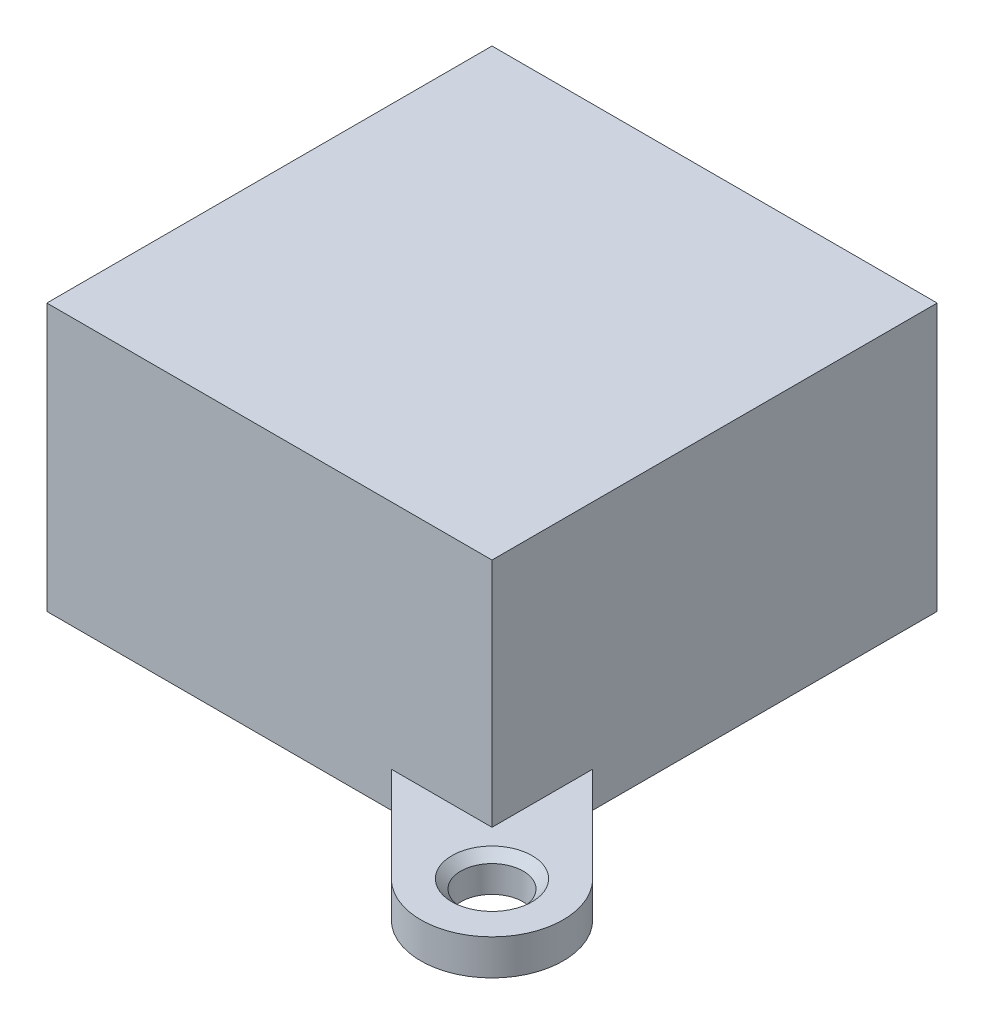
ISO-10303-21;
HEADER;
FILE_DESCRIPTION(('STEP AP214'),'2;1');
FILE_NAME('part.step','',(''),(''),'','','');
FILE_SCHEMA(('AUTOMOTIVE_DESIGN { 1 0 10303 214 1 1 1 1 }'));
ENDSEC;
DATA;
#1=APPLICATION_CONTEXT('core data for automotive mechanical design processes');
#2=APPLICATION_PROTOCOL_DEFINITION('international standard','automotive_design',2000,#1);
#3=PRODUCT_CONTEXT('',#1,'mechanical');
#4=PRODUCT('Part','Part','',(#3));
#5=PRODUCT_RELATED_PRODUCT_CATEGORY('part','',(#4));
#6=PRODUCT_DEFINITION_FORMATION('','',#4);
#7=PRODUCT_DEFINITION_CONTEXT('part definition',#1,'design');
#8=PRODUCT_DEFINITION('design','',#6,#7);
#9=PRODUCT_DEFINITION_SHAPE('','',#8);
#10=(LENGTH_UNIT() NAMED_UNIT(*) SI_UNIT(.MILLI.,.METRE.));
#11=(NAMED_UNIT(*) PLANE_ANGLE_UNIT() SI_UNIT($,.RADIAN.));
#12=(NAMED_UNIT(*) SI_UNIT($,.STERADIAN.) SOLID_ANGLE_UNIT());
#13=UNCERTAINTY_MEASURE_WITH_UNIT(LENGTH_MEASURE(1.E-05),#10,'distance_accuracy_value','');
#14=(GEOMETRIC_REPRESENTATION_CONTEXT(3) GLOBAL_UNCERTAINTY_ASSIGNED_CONTEXT((#13)) GLOBAL_UNIT_ASSIGNED_CONTEXT((#10,
#11,#12)) REPRESENTATION_CONTEXT('',''));
#15=CARTESIAN_POINT('',(0.,0.,0.));
#16=DIRECTION('',(0.,0.,1.));
#17=DIRECTION('',(1.,0.,0.));
#18=AXIS2_PLACEMENT_3D('',#15,#16,#17);
#19=CARTESIAN_POINT('',(15.,1.99999999989586,15.));
#20=DIRECTION('',(0.,1.,0.));
#21=DIRECTION('',(0.,0.,1.));
#22=AXIS2_PLACEMENT_3D('',#19,#20,#21);
#23=CONICAL_SURFACE('',#22,2.24999999987631,0.785398163397448);
#24=CARTESIAN_POINT('',(15.,1.5,15.));
#25=DIRECTION('',(0.,1.,0.));
#26=DIRECTION('',(0.,0.,1.));
#27=AXIS2_PLACEMENT_3D('',#24,#25,#26);
#28=CIRCLE('',#27,1.75);
#29=CARTESIAN_POINT('',(15.,1.5,16.75));
#30=VERTEX_POINT('',#29);
#31=EDGE_CURVE('E154',#30,#30,#28,.F.);
#32=ORIENTED_EDGE('',*,*,#31,.T.);
#33=EDGE_LOOP('',(#32));
#34=FACE_BOUND('',#33,.T.);
#35=CARTESIAN_POINT('',(15.,2.00000000002319,15.));
#36=DIRECTION('',(0.,1.,0.));
#37=DIRECTION('',(0.,0.,1.));
#38=AXIS2_PLACEMENT_3D('',#35,#36,#37);
#39=CIRCLE('',#38,2.25000000000364);
#40=CARTESIAN_POINT('',(15.,2.00000000002319,17.2500000000036));
#41=VERTEX_POINT('',#40);
#42=EDGE_CURVE('E19',#41,#41,#39,.T.);
#43=ORIENTED_EDGE('',*,*,#42,.T.);
#44=EDGE_LOOP('',(#43));
#45=FACE_BOUND('',#44,.T.);
#46=ADVANCED_FACE('F16',(#34,#45),#23,.F.);
#47=CARTESIAN_POINT('',(-15.,1.99999999995271,-15.));
#48=DIRECTION('',(0.,1.,0.));
#49=DIRECTION('',(0.,0.,1.));
#50=AXIS2_PLACEMENT_3D('',#47,#48,#49);
#51=CONICAL_SURFACE('',#50,2.24999999990359,0.785398163397448);
#52=CARTESIAN_POINT('',(-15.,1.5,-15.));
#53=DIRECTION('',(0.,1.,0.));
#54=DIRECTION('',(0.,0.,1.));
#55=AXIS2_PLACEMENT_3D('',#52,#53,#54);
#56=CIRCLE('',#55,1.75);
#57=CARTESIAN_POINT('',(-15.,1.5,-13.25));
#58=VERTEX_POINT('',#57);
#59=EDGE_CURVE('E151',#58,#58,#56,.F.);
#60=ORIENTED_EDGE('',*,*,#59,.T.);
#61=EDGE_LOOP('',(#60));
#62=FACE_BOUND('',#61,.T.);
#63=CARTESIAN_POINT('',(-15.,1.99999999999591,-15.));
#64=DIRECTION('',(0.,1.,0.));
#65=DIRECTION('',(0.,0.,1.));
#66=AXIS2_PLACEMENT_3D('',#63,#64,#65);
#67=CIRCLE('',#66,2.24999999994679);
#68=CARTESIAN_POINT('',(-15.,1.99999999999591,-12.7500000000532));
#69=VERTEX_POINT('',#68);
#70=EDGE_CURVE('E159',#69,#69,#67,.T.);
#71=ORIENTED_EDGE('',*,*,#70,.T.);
#72=EDGE_LOOP('',(#71));
#73=FACE_BOUND('',#72,.T.);
#74=ADVANCED_FACE('F242',(#62,#73),#51,.F.);
#75=CARTESIAN_POINT('',(15.,2.,15.));
#76=DIRECTION('',(0.,-1.,0.));
#77=DIRECTION('',(0.,0.,-1.));
#78=AXIS2_PLACEMENT_3D('',#75,#76,#77);
#79=PLANE('',#78);
#80=DIRECTION('',(0.,0.,1.));
#81=VECTOR('',#80,1.);
#82=CARTESIAN_POINT('',(12.5,2.,12.5));
#83=LINE('',#82,#81);
#84=CARTESIAN_POINT('',(12.4999999999997,2.,6.84314575050833));
#85=VERTEX_POINT('',#84);
#86=CARTESIAN_POINT('',(12.5,2.,12.5));
#87=VERTEX_POINT('',#86);
#88=EDGE_CURVE('E210',#85,#87,#83,.T.);
#89=ORIENTED_EDGE('',*,*,#88,.T.);
#90=DIRECTION('',(1.,0.,0.));
#91=VECTOR('',#90,1.);
#92=CARTESIAN_POINT('',(0.,2.,12.5));
#93=LINE('',#92,#91);
#94=CARTESIAN_POINT('',(6.843145750508,2.,12.5));
#95=VERTEX_POINT('',#94);
#96=EDGE_CURVE('E122',#95,#87,#93,.T.);
#97=ORIENTED_EDGE('',*,*,#96,.F.);
#98=DIRECTION('',(0.707106781186548,0.,0.707106781186548));
#99=VECTOR('',#98,1.);
#100=CARTESIAN_POINT('',(12.171572875254,2.,17.828427124746));
#101=LINE('',#100,#99);
#102=CARTESIAN_POINT('',(12.1715728752539,2.,17.8284271247461));
#103=VERTEX_POINT('',#102);
#104=EDGE_CURVE('E118',#103,#95,#101,.F.);
#105=ORIENTED_EDGE('',*,*,#104,.F.);
#106=CARTESIAN_POINT('',(15.,2.,15.));
#107=DIRECTION('',(0.,-1.,0.));
#108=DIRECTION('',(0.,0.,-1.));
#109=AXIS2_PLACEMENT_3D('',#106,#107,#108);
#110=CIRCLE('',#109,4.);
#111=CARTESIAN_POINT('',(17.828427124745,2.,12.171572875255));
#112=VERTEX_POINT('',#111);
#113=EDGE_CURVE('E106',#112,#103,#110,.T.);
#114=ORIENTED_EDGE('',*,*,#113,.F.);
#115=DIRECTION('',(-0.707106781186548,0.,-0.707106781186548));
#116=VECTOR('',#115,1.);
#117=CARTESIAN_POINT('',(-12.17157287525,2.,-17.82842712474));
#118=LINE('',#117,#116);
#119=EDGE_CURVE('E101',#85,#112,#118,.F.);
#120=ORIENTED_EDGE('',*,*,#119,.F.);
#121=EDGE_LOOP('',(#89,#97,#105,#114,#120));
#122=FACE_BOUND('',#121,.T.);
#123=ORIENTED_EDGE('',*,*,#42,.F.);
#124=EDGE_LOOP('',(#123));
#125=FACE_BOUND('',#124,.T.);
#126=ADVANCED_FACE('F120',(#122,#125),#79,.F.);
#127=CARTESIAN_POINT('',(-12.5,15.,12.5));
#128=DIRECTION('',(0.,-1.,0.));
#129=DIRECTION('',(0.,0.,-1.));
#130=AXIS2_PLACEMENT_3D('',#127,#128,#129);
#131=PLANE('',#130);
#132=DIRECTION('',(0.,0.,1.));
#133=VECTOR('',#132,1.);
#134=CARTESIAN_POINT('',(-12.5,15.,12.5));
#135=LINE('',#134,#133);
#136=CARTESIAN_POINT('',(-12.5,15.,-12.5));
#137=VERTEX_POINT('',#136);
#138=CARTESIAN_POINT('',(-12.5,15.,12.5));
#139=VERTEX_POINT('',#138);
#140=EDGE_CURVE('E148',#137,#139,#135,.T.);
#141=ORIENTED_EDGE('',*,*,#140,.T.);
#142=DIRECTION('',(1.,0.,0.));
#143=VECTOR('',#142,1.);
#144=CARTESIAN_POINT('',(0.,15.,12.5));
#145=LINE('',#144,#143);
#146=CARTESIAN_POINT('',(12.5,15.,12.5));
#147=VERTEX_POINT('',#146);
#148=EDGE_CURVE('E125',#147,#139,#145,.F.);
#149=ORIENTED_EDGE('',*,*,#148,.F.);
#150=DIRECTION('',(0.,0.,1.));
#151=VECTOR('',#150,1.);
#152=CARTESIAN_POINT('',(12.5,15.,12.5));
#153=LINE('',#152,#151);
#154=CARTESIAN_POINT('',(12.5,15.,-12.5));
#155=VERTEX_POINT('',#154);
#156=EDGE_CURVE('E202',#147,#155,#153,.F.);
#157=ORIENTED_EDGE('',*,*,#156,.T.);
#158=DIRECTION('',(1.,0.,0.));
#159=VECTOR('',#158,1.);
#160=CARTESIAN_POINT('',(0.,15.,-12.5));
#161=LINE('',#160,#159);
#162=EDGE_CURVE('E186',#155,#137,#161,.F.);
#163=ORIENTED_EDGE('',*,*,#162,.T.);
#164=EDGE_LOOP('',(#141,#149,#157,#163));
#165=FACE_BOUND('',#164,.T.);
#166=ADVANCED_FACE('F241',(#165),#131,.F.);
#167=CARTESIAN_POINT('',(15.,2.,15.));
#168=DIRECTION('',(0.,-1.,0.));
#169=DIRECTION('',(0.,0.,-1.));
#170=AXIS2_PLACEMENT_3D('',#167,#168,#169);
#171=PLANE('',#170);
#172=DIRECTION('',(0.,0.,1.));
#173=VECTOR('',#172,1.);
#174=CARTESIAN_POINT('',(-12.5,2.,12.5));
#175=LINE('',#174,#173);
#176=CARTESIAN_POINT('',(-12.5,2.,-6.843145750508));
#177=VERTEX_POINT('',#176);
#178=CARTESIAN_POINT('',(-12.5,2.,-12.5));
#179=VERTEX_POINT('',#178);
#180=EDGE_CURVE('E168',#177,#179,#175,.F.);
#181=ORIENTED_EDGE('',*,*,#180,.T.);
#182=DIRECTION('',(1.,0.,0.));
#183=VECTOR('',#182,1.);
#184=CARTESIAN_POINT('',(0.,2.,-12.5));
#185=LINE('',#184,#183);
#186=CARTESIAN_POINT('',(-6.84314575050866,2.,-12.4999999999993));
#187=VERTEX_POINT('',#186);
#188=EDGE_CURVE('E188',#179,#187,#185,.T.);
#189=ORIENTED_EDGE('',*,*,#188,.T.);
#190=DIRECTION('',(-0.707106781186548,0.,-0.707106781186548));
#191=VECTOR('',#190,1.);
#192=CARTESIAN_POINT('',(-12.17157287525,2.,-17.82842712474));
#193=LINE('',#192,#191);
#194=CARTESIAN_POINT('',(-12.1715728752519,2.,-17.8284271247431));
#195=VERTEX_POINT('',#194);
#196=EDGE_CURVE('E196',#195,#187,#193,.F.);
#197=ORIENTED_EDGE('',*,*,#196,.F.);
#198=CARTESIAN_POINT('',(-15.,2.,-15.));
#199=DIRECTION('',(0.,-1.,0.));
#200=DIRECTION('',(0.,0.,-1.));
#201=AXIS2_PLACEMENT_3D('',#198,#199,#200);
#202=CIRCLE('',#201,4.);
#203=CARTESIAN_POINT('',(-17.8284271247435,2.,-12.1715728752515));
#204=VERTEX_POINT('',#203);
#205=EDGE_CURVE('E199',#204,#195,#202,.T.);
#206=ORIENTED_EDGE('',*,*,#205,.F.);
#207=DIRECTION('',(0.707106781186548,0.,0.707106781186548));
#208=VECTOR('',#207,1.);
#209=CARTESIAN_POINT('',(12.171572875254,2.,17.828427124746));
#210=LINE('',#209,#208);
#211=EDGE_CURVE('E162',#177,#204,#210,.F.);
#212=ORIENTED_EDGE('',*,*,#211,.F.);
#213=EDGE_LOOP('',(#181,#189,#197,#206,#212));
#214=FACE_BOUND('',#213,.T.);
#215=ORIENTED_EDGE('',*,*,#70,.F.);
#216=EDGE_LOOP('',(#215));
#217=FACE_BOUND('',#216,.T.);
#218=ADVANCED_FACE('F249',(#214,#217),#171,.F.);
#219=CARTESIAN_POINT('',(15.,0.,15.));
#220=DIRECTION('',(0.,1.,0.));
#221=DIRECTION('',(0.,0.,1.));
#222=AXIS2_PLACEMENT_3D('',#219,#220,#221);
#223=CYLINDRICAL_SURFACE('',#222,1.75);
#224=CARTESIAN_POINT('',(15.,0.,15.));
#225=DIRECTION('',(0.,1.,0.));
#226=DIRECTION('',(0.,0.,1.));
#227=AXIS2_PLACEMENT_3D('',#224,#225,#226);
#228=CIRCLE('',#227,1.75);
#229=CARTESIAN_POINT('',(15.,0.,16.75));
#230=VERTEX_POINT('',#229);
#231=EDGE_CURVE('E171',#230,#230,#228,.F.);
#232=ORIENTED_EDGE('',*,*,#231,.T.);
#233=EDGE_LOOP('',(#232));
#234=FACE_BOUND('',#233,.T.);
#235=ORIENTED_EDGE('',*,*,#31,.F.);
#236=EDGE_LOOP('',(#235));
#237=FACE_BOUND('',#236,.T.);
#238=ADVANCED_FACE('F299',(#234,#237),#223,.F.);
#239=CARTESIAN_POINT('',(-15.,0.,-15.));
#240=DIRECTION('',(0.,1.,0.));
#241=DIRECTION('',(0.,0.,1.));
#242=AXIS2_PLACEMENT_3D('',#239,#240,#241);
#243=CYLINDRICAL_SURFACE('',#242,1.75);
#244=CARTESIAN_POINT('',(-15.,0.,-15.));
#245=DIRECTION('',(0.,1.,0.));
#246=DIRECTION('',(0.,0.,1.));
#247=AXIS2_PLACEMENT_3D('',#244,#245,#246);
#248=CIRCLE('',#247,1.75);
#249=CARTESIAN_POINT('',(-15.,0.,-13.25));
#250=VERTEX_POINT('',#249);
#251=EDGE_CURVE('E142',#250,#250,#248,.F.);
#252=ORIENTED_EDGE('',*,*,#251,.T.);
#253=EDGE_LOOP('',(#252));
#254=FACE_BOUND('',#253,.T.);
#255=ORIENTED_EDGE('',*,*,#59,.F.);
#256=EDGE_LOOP('',(#255));
#257=FACE_BOUND('',#256,.T.);
#258=ADVANCED_FACE('F295',(#254,#257),#243,.F.);
#259=CARTESIAN_POINT('',(0.,0.,12.5));
#260=DIRECTION('',(0.,0.,1.));
#261=DIRECTION('',(1.,0.,0.));
#262=AXIS2_PLACEMENT_3D('',#259,#260,#261);
#263=PLANE('',#262);
#264=DIRECTION('',(0.,1.,0.));
#265=VECTOR('',#264,1.);
#266=CARTESIAN_POINT('',(-12.5,15.,12.5));
#267=LINE('',#266,#265);
#268=CARTESIAN_POINT('',(-12.5,0.,12.5));
#269=VERTEX_POINT('',#268);
#270=EDGE_CURVE('E145',#139,#269,#267,.F.);
#271=ORIENTED_EDGE('',*,*,#270,.T.);
#272=DIRECTION('',(1.,0.,0.));
#273=VECTOR('',#272,1.);
#274=CARTESIAN_POINT('',(-12.5,0.,12.5));
#275=LINE('',#274,#273);
#276=CARTESIAN_POINT('',(6.843145750508,0.,12.5));
#277=VERTEX_POINT('',#276);
#278=EDGE_CURVE('E139',#269,#277,#275,.T.);
#279=ORIENTED_EDGE('',*,*,#278,.T.);
#280=DIRECTION('',(0.,1.,0.));
#281=VECTOR('',#280,1.);
#282=CARTESIAN_POINT('',(6.843145750508,2.,12.5));
#283=LINE('',#282,#281);
#284=EDGE_CURVE('E115',#95,#277,#283,.F.);
#285=ORIENTED_EDGE('',*,*,#284,.F.);
#286=ORIENTED_EDGE('',*,*,#96,.T.);
#287=DIRECTION('',(0.,-1.,0.));
#288=VECTOR('',#287,1.);
#289=CARTESIAN_POINT('',(12.5,15.,12.5));
#290=LINE('',#289,#288);
#291=EDGE_CURVE('E205',#87,#147,#290,.F.);
#292=ORIENTED_EDGE('',*,*,#291,.T.);
#293=ORIENTED_EDGE('',*,*,#148,.T.);
#294=EDGE_LOOP('',(#271,#279,#285,#286,#292,#293));
#295=FACE_BOUND('',#294,.T.);
#296=ADVANCED_FACE('F292',(#295),#263,.T.);
#297=CARTESIAN_POINT('',(12.171572875254,2.,17.828427124746));
#298=DIRECTION('',(-0.707106781186548,0.,0.707106781186548));
#299=DIRECTION('',(0.707106781186548,0.,0.707106781186548));
#300=AXIS2_PLACEMENT_3D('',#297,#298,#299);
#301=PLANE('',#300);
#302=DIRECTION('',(0.707106781186547,0.,0.707106781186547));
#303=VECTOR('',#302,1.);
#304=CARTESIAN_POINT('',(6.843145750508,0.,12.5));
#305=LINE('',#304,#303);
#306=CARTESIAN_POINT('',(12.1715728752539,0.,17.8284271247461));
#307=VERTEX_POINT('',#306);
#308=EDGE_CURVE('E130',#277,#307,#305,.T.);
#309=ORIENTED_EDGE('',*,*,#308,.T.);
#310=DIRECTION('',(0.,-1.,0.));
#311=VECTOR('',#310,1.);
#312=CARTESIAN_POINT('',(12.1715728752538,2.,17.8284271247462));
#313=LINE('',#312,#311);
#314=EDGE_CURVE('E111',#103,#307,#313,.T.);
#315=ORIENTED_EDGE('',*,*,#314,.F.);
#316=ORIENTED_EDGE('',*,*,#104,.T.);
#317=ORIENTED_EDGE('',*,*,#284,.T.);
#318=EDGE_LOOP('',(#309,#315,#316,#317));
#319=FACE_BOUND('',#318,.T.);
#320=ADVANCED_FACE('F128',(#319),#301,.T.);
#321=CARTESIAN_POINT('',(15.,2.,15.));
#322=DIRECTION('',(0.,-1.,0.));
#323=DIRECTION('',(0.,0.,-1.));
#324=AXIS2_PLACEMENT_3D('',#321,#322,#323);
#325=CYLINDRICAL_SURFACE('',#324,4.);
#326=ORIENTED_EDGE('',*,*,#113,.T.);
#327=ORIENTED_EDGE('',*,*,#314,.T.);
#328=CARTESIAN_POINT('',(15.,0.,15.));
#329=DIRECTION('',(0.,-1.,0.));
#330=DIRECTION('',(0.,0.,-1.));
#331=AXIS2_PLACEMENT_3D('',#328,#329,#330);
#332=CIRCLE('',#331,4.);
#333=CARTESIAN_POINT('',(17.8284271247455,0.,12.1715728752545));
#334=VERTEX_POINT('',#333);
#335=EDGE_CURVE('E227',#307,#334,#332,.F.);
#336=ORIENTED_EDGE('',*,*,#335,.T.);
#337=DIRECTION('',(0.,1.,0.));
#338=VECTOR('',#337,1.);
#339=CARTESIAN_POINT('',(17.828427124745,2.,12.171572875255));
#340=LINE('',#339,#338);
#341=EDGE_CURVE('E113',#112,#334,#340,.F.);
#342=ORIENTED_EDGE('',*,*,#341,.F.);
#343=EDGE_LOOP('',(#326,#327,#336,#342));
#344=FACE_BOUND('',#343,.T.);
#345=ADVANCED_FACE('F108',(#344),#325,.T.);
#346=CARTESIAN_POINT('',(-12.17157287525,2.,-17.82842712474));
#347=DIRECTION('',(0.707106781186548,0.,-0.707106781186548));
#348=DIRECTION('',(-0.707106781186548,0.,-0.707106781186548));
#349=AXIS2_PLACEMENT_3D('',#346,#347,#348);
#350=PLANE('',#349);
#351=ORIENTED_EDGE('',*,*,#341,.T.);
#352=DIRECTION('',(-0.707106781186547,0.,-0.707106781186548));
#353=VECTOR('',#352,1.);
#354=CARTESIAN_POINT('',(17.828427124746,0.,12.171572875254));
#355=LINE('',#354,#353);
#356=CARTESIAN_POINT('',(12.5,0.,6.843145750508));
#357=VERTEX_POINT('',#356);
#358=EDGE_CURVE('E229',#334,#357,#355,.T.);
#359=ORIENTED_EDGE('',*,*,#358,.T.);
#360=DIRECTION('',(0.,-1.,0.));
#361=VECTOR('',#360,1.);
#362=CARTESIAN_POINT('',(12.5,15.,6.843145750508));
#363=LINE('',#362,#361);
#364=EDGE_CURVE('E204',#357,#85,#363,.F.);
#365=ORIENTED_EDGE('',*,*,#364,.T.);
#366=ORIENTED_EDGE('',*,*,#119,.T.);
#367=EDGE_LOOP('',(#351,#359,#365,#366));
#368=FACE_BOUND('',#367,.T.);
#369=ADVANCED_FACE('F284',(#368),#350,.T.);
#370=CARTESIAN_POINT('',(12.5,15.,12.5));
#371=DIRECTION('',(-1.,0.,0.));
#372=DIRECTION('',(0.,-1.,0.));
#373=AXIS2_PLACEMENT_3D('',#370,#371,#372);
#374=PLANE('',#373);
#375=ORIENTED_EDGE('',*,*,#364,.F.);
#376=DIRECTION('',(0.,0.,1.));
#377=VECTOR('',#376,1.);
#378=CARTESIAN_POINT('',(12.5,0.,12.5));
#379=LINE('',#378,#377);
#380=CARTESIAN_POINT('',(12.5,0.,-12.5));
#381=VERTEX_POINT('',#380);
#382=EDGE_CURVE('E327',#357,#381,#379,.F.);
#383=ORIENTED_EDGE('',*,*,#382,.T.);
#384=DIRECTION('',(0.,1.,0.));
#385=VECTOR('',#384,1.);
#386=CARTESIAN_POINT('',(12.5,0.,-12.5));
#387=LINE('',#386,#385);
#388=EDGE_CURVE('E189',#381,#155,#387,.T.);
#389=ORIENTED_EDGE('',*,*,#388,.T.);
#390=ORIENTED_EDGE('',*,*,#156,.F.);
#391=ORIENTED_EDGE('',*,*,#291,.F.);
#392=ORIENTED_EDGE('',*,*,#88,.F.);
#393=EDGE_LOOP('',(#375,#383,#389,#390,#391,#392));
#394=FACE_BOUND('',#393,.T.);
#395=ADVANCED_FACE('F280',(#394),#374,.F.);
#396=CARTESIAN_POINT('',(0.,0.,-12.5));
#397=DIRECTION('',(0.,0.,1.));
#398=DIRECTION('',(1.,0.,0.));
#399=AXIS2_PLACEMENT_3D('',#396,#397,#398);
#400=PLANE('',#399);
#401=DIRECTION('',(0.,1.,0.));
#402=VECTOR('',#401,1.);
#403=CARTESIAN_POINT('',(-6.843145750509,2.,-12.499999999999));
#404=LINE('',#403,#402);
#405=CARTESIAN_POINT('',(-6.84314575050833,0.,-12.4999999999997));
#406=VERTEX_POINT('',#405);
#407=EDGE_CURVE('E193',#187,#406,#404,.F.);
#408=ORIENTED_EDGE('',*,*,#407,.F.);
#409=ORIENTED_EDGE('',*,*,#188,.F.);
#410=DIRECTION('',(0.,1.,0.));
#411=VECTOR('',#410,1.);
#412=CARTESIAN_POINT('',(-12.5,15.,-12.5));
#413=LINE('',#412,#411);
#414=EDGE_CURVE('E179',#179,#137,#413,.T.);
#415=ORIENTED_EDGE('',*,*,#414,.T.);
#416=ORIENTED_EDGE('',*,*,#162,.F.);
#417=ORIENTED_EDGE('',*,*,#388,.F.);
#418=DIRECTION('',(1.,0.,0.));
#419=VECTOR('',#418,1.);
#420=CARTESIAN_POINT('',(-12.5,0.,-12.5));
#421=LINE('',#420,#419);
#422=EDGE_CURVE('E324',#381,#406,#421,.F.);
#423=ORIENTED_EDGE('',*,*,#422,.T.);
#424=EDGE_LOOP('',(#408,#409,#415,#416,#417,#423));
#425=FACE_BOUND('',#424,.T.);
#426=ADVANCED_FACE('F276',(#425),#400,.F.);
#427=CARTESIAN_POINT('',(-12.17157287525,2.,-17.82842712474));
#428=DIRECTION('',(0.707106781186548,0.,-0.707106781186548));
#429=DIRECTION('',(-0.707106781186548,0.,-0.707106781186548));
#430=AXIS2_PLACEMENT_3D('',#427,#428,#429);
#431=PLANE('',#430);
#432=DIRECTION('',(0.,-1.,0.));
#433=VECTOR('',#432,1.);
#434=CARTESIAN_POINT('',(-12.1715728752488,2.,-17.8284271247412));
#435=LINE('',#434,#433);
#436=CARTESIAN_POINT('',(-12.1715728752522,0.,-17.8284271247434));
#437=VERTEX_POINT('',#436);
#438=EDGE_CURVE('E165',#195,#437,#435,.T.);
#439=ORIENTED_EDGE('',*,*,#438,.F.);
#440=ORIENTED_EDGE('',*,*,#196,.T.);
#441=ORIENTED_EDGE('',*,*,#407,.T.);
#442=DIRECTION('',(-0.70710678118668,0.,-0.707106781186415));
#443=VECTOR('',#442,1.);
#444=CARTESIAN_POINT('',(-6.843145750508,0.,-12.5));
#445=LINE('',#444,#443);
#446=EDGE_CURVE('E226',#406,#437,#445,.T.);
#447=ORIENTED_EDGE('',*,*,#446,.T.);
#448=EDGE_LOOP('',(#439,#440,#441,#447));
#449=FACE_BOUND('',#448,.T.);
#450=ADVANCED_FACE('F272',(#449),#431,.T.);
#451=CARTESIAN_POINT('',(-15.,2.,-15.));
#452=DIRECTION('',(0.,-1.,0.));
#453=DIRECTION('',(0.,0.,-1.));
#454=AXIS2_PLACEMENT_3D('',#451,#452,#453);
#455=CYLINDRICAL_SURFACE('',#454,4.);
#456=ORIENTED_EDGE('',*,*,#205,.T.);
#457=ORIENTED_EDGE('',*,*,#438,.T.);
#458=CARTESIAN_POINT('',(-15.,0.,-15.));
#459=DIRECTION('',(0.,-1.,0.));
#460=DIRECTION('',(0.,0.,-1.));
#461=AXIS2_PLACEMENT_3D('',#458,#459,#460);
#462=CIRCLE('',#461,4.);
#463=CARTESIAN_POINT('',(-17.8284271247433,0.,-12.1715728752523));
#464=VERTEX_POINT('',#463);
#465=EDGE_CURVE('E223',#437,#464,#462,.F.);
#466=ORIENTED_EDGE('',*,*,#465,.T.);
#467=DIRECTION('',(0.,1.,0.));
#468=VECTOR('',#467,1.);
#469=CARTESIAN_POINT('',(-17.828427124741,2.,-12.171572875249));
#470=LINE('',#469,#468);
#471=EDGE_CURVE('E164',#204,#464,#470,.F.);
#472=ORIENTED_EDGE('',*,*,#471,.F.);
#473=EDGE_LOOP('',(#456,#457,#466,#472));
#474=FACE_BOUND('',#473,.T.);
#475=ADVANCED_FACE('F268',(#474),#455,.T.);
#476=CARTESIAN_POINT('',(12.171572875254,2.,17.828427124746));
#477=DIRECTION('',(-0.707106781186548,0.,0.707106781186548));
#478=DIRECTION('',(0.707106781186548,0.,0.707106781186548));
#479=AXIS2_PLACEMENT_3D('',#476,#477,#478);
#480=PLANE('',#479);
#481=ORIENTED_EDGE('',*,*,#471,.T.);
#482=DIRECTION('',(0.707106781186415,0.,0.70710678118668));
#483=VECTOR('',#482,1.);
#484=CARTESIAN_POINT('',(-17.82842712474,0.,-12.17157287525));
#485=LINE('',#484,#483);
#486=CARTESIAN_POINT('',(-12.5,0.,-6.843145750508));
#487=VERTEX_POINT('',#486);
#488=EDGE_CURVE('E25',#464,#487,#485,.T.);
#489=ORIENTED_EDGE('',*,*,#488,.T.);
#490=DIRECTION('',(0.,1.,0.));
#491=VECTOR('',#490,1.);
#492=CARTESIAN_POINT('',(-12.5,15.,-6.843145750508));
#493=LINE('',#492,#491);
#494=EDGE_CURVE('E33',#487,#177,#493,.T.);
#495=ORIENTED_EDGE('',*,*,#494,.T.);
#496=ORIENTED_EDGE('',*,*,#211,.T.);
#497=EDGE_LOOP('',(#481,#489,#495,#496));
#498=FACE_BOUND('',#497,.T.);
#499=ADVANCED_FACE('F261',(#498),#480,.T.);
#500=CARTESIAN_POINT('',(-12.5,15.,12.5));
#501=DIRECTION('',(1.,0.,0.));
#502=DIRECTION('',(0.,1.,0.));
#503=AXIS2_PLACEMENT_3D('',#500,#501,#502);
#504=PLANE('',#503);
#505=ORIENTED_EDGE('',*,*,#494,.F.);
#506=DIRECTION('',(0.,0.,1.));
#507=VECTOR('',#506,1.);
#508=CARTESIAN_POINT('',(-12.5,0.,12.5));
#509=LINE('',#508,#507);
#510=EDGE_CURVE('E11',#487,#269,#509,.T.);
#511=ORIENTED_EDGE('',*,*,#510,.T.);
#512=ORIENTED_EDGE('',*,*,#270,.F.);
#513=ORIENTED_EDGE('',*,*,#140,.F.);
#514=ORIENTED_EDGE('',*,*,#414,.F.);
#515=ORIENTED_EDGE('',*,*,#180,.F.);
#516=EDGE_LOOP('',(#505,#511,#512,#513,#514,#515));
#517=FACE_BOUND('',#516,.T.);
#518=ADVANCED_FACE('F255',(#517),#504,.F.);
#519=CARTESIAN_POINT('',(-12.5,0.,12.5));
#520=DIRECTION('',(0.,1.,0.));
#521=DIRECTION('',(0.,0.,1.));
#522=AXIS2_PLACEMENT_3D('',#519,#520,#521);
#523=PLANE('',#522);
#524=ORIENTED_EDGE('',*,*,#488,.F.);
#525=ORIENTED_EDGE('',*,*,#465,.F.);
#526=ORIENTED_EDGE('',*,*,#446,.F.);
#527=ORIENTED_EDGE('',*,*,#422,.F.);
#528=ORIENTED_EDGE('',*,*,#382,.F.);
#529=ORIENTED_EDGE('',*,*,#358,.F.);
#530=ORIENTED_EDGE('',*,*,#335,.F.);
#531=ORIENTED_EDGE('',*,*,#308,.F.);
#532=ORIENTED_EDGE('',*,*,#278,.F.);
#533=ORIENTED_EDGE('',*,*,#510,.F.);
#534=EDGE_LOOP('',(#524,#525,#526,#527,#528,#529,#530,#531,#532,#533));
#535=FACE_BOUND('',#534,.T.);
#536=ORIENTED_EDGE('',*,*,#251,.F.);
#537=EDGE_LOOP('',(#536));
#538=FACE_BOUND('',#537,.T.);
#539=ORIENTED_EDGE('',*,*,#231,.F.);
#540=EDGE_LOOP('',(#539));
#541=FACE_BOUND('',#540,.T.);
#542=ADVANCED_FACE('F253',(#535,#538,#541),#523,.F.);
#543=CLOSED_SHELL('',(#46,#74,#126,#166,#218,#238,#258,#296,#320,#345,#369,#395,#426,#450,#475,
#499,#518,#542));
#544=MANIFOLD_SOLID_BREP('B1',#543);
#545=ADVANCED_BREP_SHAPE_REPRESENTATION('',(#18,#544),#14);
#546=SHAPE_DEFINITION_REPRESENTATION(#9,#545);
ENDSEC;
END-ISO-10303-21;
